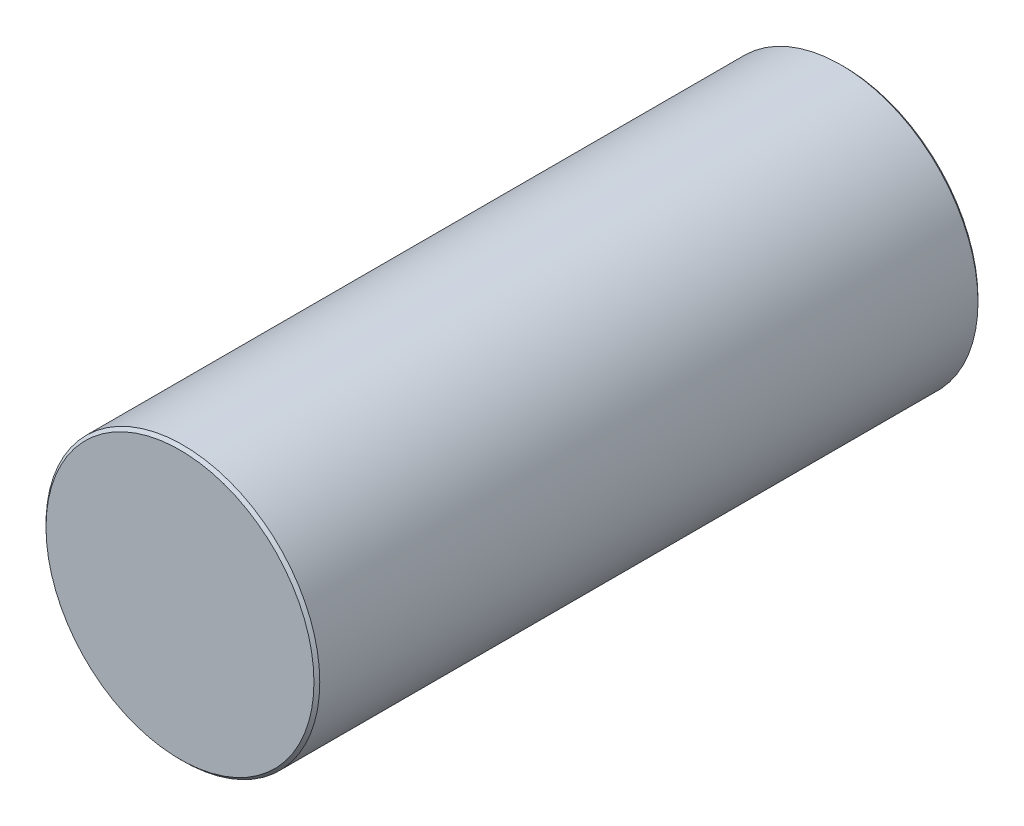
ISO-10303-21;
HEADER;
FILE_DESCRIPTION(('STEP AP214'),'2;1');
FILE_NAME('part.step','',(''),(''),'','','');
FILE_SCHEMA(('AUTOMOTIVE_DESIGN { 1 0 10303 214 1 1 1 1 }'));
ENDSEC;
DATA;
#1=APPLICATION_CONTEXT('core data for automotive mechanical design processes');
#2=APPLICATION_PROTOCOL_DEFINITION('international standard','automotive_design',2000,#1);
#3=PRODUCT_CONTEXT('',#1,'mechanical');
#4=PRODUCT('Part','Part','',(#3));
#5=PRODUCT_RELATED_PRODUCT_CATEGORY('part','',(#4));
#6=PRODUCT_DEFINITION_FORMATION('','',#4);
#7=PRODUCT_DEFINITION_CONTEXT('part definition',#1,'design');
#8=PRODUCT_DEFINITION('design','',#6,#7);
#9=PRODUCT_DEFINITION_SHAPE('','',#8);
#10=(LENGTH_UNIT() NAMED_UNIT(*) SI_UNIT(.MILLI.,.METRE.));
#11=(NAMED_UNIT(*) PLANE_ANGLE_UNIT() SI_UNIT($,.RADIAN.));
#12=(NAMED_UNIT(*) SI_UNIT($,.STERADIAN.) SOLID_ANGLE_UNIT());
#13=UNCERTAINTY_MEASURE_WITH_UNIT(LENGTH_MEASURE(1.E-05),#10,'distance_accuracy_value','');
#14=(GEOMETRIC_REPRESENTATION_CONTEXT(3) GLOBAL_UNCERTAINTY_ASSIGNED_CONTEXT((#13)) GLOBAL_UNIT_ASSIGNED_CONTEXT((#10,
#11,#12)) REPRESENTATION_CONTEXT('',''));
#15=CARTESIAN_POINT('',(0.,0.,0.));
#16=DIRECTION('',(0.,0.,1.));
#17=DIRECTION('',(1.,0.,0.));
#18=AXIS2_PLACEMENT_3D('',#15,#16,#17);
#19=CARTESIAN_POINT('',(0.,0.,11.4));
#20=DIRECTION('',(0.,0.,-1.));
#21=DIRECTION('',(-1.,0.,0.));
#22=AXIS2_PLACEMENT_3D('',#19,#20,#21);
#23=CYLINDRICAL_SURFACE('',#22,2.35);
#24=CARTESIAN_POINT('',(0.,0.,11.35));
#25=DIRECTION('',(0.,0.,1.));
#26=DIRECTION('',(1.,0.,0.));
#27=AXIS2_PLACEMENT_3D('',#24,#25,#26);
#28=CIRCLE('',#27,2.35);
#29=CARTESIAN_POINT('',(2.35,0.,11.35));
#30=VERTEX_POINT('',#29);
#31=EDGE_CURVE('E54',#30,#30,#28,.F.);
#32=ORIENTED_EDGE('',*,*,#31,.T.);
#33=EDGE_LOOP('',(#32));
#34=FACE_BOUND('',#33,.T.);
#35=CARTESIAN_POINT('',(0.,0.,0.0500000000000032));
#36=DIRECTION('',(0.,0.,1.));
#37=DIRECTION('',(1.,0.,0.));
#38=AXIS2_PLACEMENT_3D('',#35,#36,#37);
#39=CIRCLE('',#38,2.35);
#40=CARTESIAN_POINT('',(2.35,0.,0.0500000000000032));
#41=VERTEX_POINT('',#40);
#42=EDGE_CURVE('E59',#41,#41,#39,.T.);
#43=ORIENTED_EDGE('',*,*,#42,.T.);
#44=EDGE_LOOP('',(#43));
#45=FACE_BOUND('',#44,.T.);
#46=ADVANCED_FACE('F45',(#34,#45),#23,.T.);
#47=CARTESIAN_POINT('',(0.,0.,11.4));
#48=DIRECTION('',(0.,0.,1.));
#49=DIRECTION('',(1.,0.,0.));
#50=AXIS2_PLACEMENT_3D('',#47,#48,#49);
#51=PLANE('',#50);
#52=CARTESIAN_POINT('',(0.,0.,11.4));
#53=DIRECTION('',(0.,0.,1.));
#54=DIRECTION('',(1.,0.,0.));
#55=AXIS2_PLACEMENT_3D('',#52,#53,#54);
#56=CIRCLE('',#55,2.3);
#57=CARTESIAN_POINT('',(2.3,0.,11.4));
#58=VERTEX_POINT('',#57);
#59=EDGE_CURVE('E64',#58,#58,#56,.T.);
#60=ORIENTED_EDGE('',*,*,#59,.T.);
#61=EDGE_LOOP('',(#60));
#62=FACE_BOUND('',#61,.T.);
#63=ADVANCED_FACE('F71',(#62),#51,.T.);
#64=CARTESIAN_POINT('',(0.,0.,0.));
#65=DIRECTION('',(0.,0.,1.));
#66=DIRECTION('',(1.,0.,0.));
#67=AXIS2_PLACEMENT_3D('',#64,#65,#66);
#68=PLANE('',#67);
#69=CARTESIAN_POINT('',(0.,0.,0.));
#70=DIRECTION('',(0.,0.,1.));
#71=DIRECTION('',(1.,0.,0.));
#72=AXIS2_PLACEMENT_3D('',#69,#70,#71);
#73=CIRCLE('',#72,2.3);
#74=CARTESIAN_POINT('',(2.3,0.,0.));
#75=VERTEX_POINT('',#74);
#76=EDGE_CURVE('E10',#75,#75,#73,.F.);
#77=ORIENTED_EDGE('',*,*,#76,.T.);
#78=EDGE_LOOP('',(#77));
#79=FACE_BOUND('',#78,.T.);
#80=ADVANCED_FACE('F75',(#79),#68,.F.);
#81=CARTESIAN_POINT('',(0.,0.,11.4));
#82=DIRECTION('',(0.,0.,-1.));
#83=DIRECTION('',(-1.,0.,0.));
#84=AXIS2_PLACEMENT_3D('',#81,#82,#83);
#85=CONICAL_SURFACE('',#84,2.3,0.78539816339747);
#86=ORIENTED_EDGE('',*,*,#31,.F.);
#87=EDGE_LOOP('',(#86));
#88=FACE_BOUND('',#87,.T.);
#89=ORIENTED_EDGE('',*,*,#59,.F.);
#90=EDGE_LOOP('',(#89));
#91=FACE_BOUND('',#90,.T.);
#92=ADVANCED_FACE('F73',(#88,#91),#85,.T.);
#93=CARTESIAN_POINT('',(0.,0.,0.0500000000000032));
#94=DIRECTION('',(0.,0.,1.));
#95=DIRECTION('',(1.,0.,0.));
#96=AXIS2_PLACEMENT_3D('',#93,#94,#95);
#97=CONICAL_SURFACE('',#96,2.35,0.785398163397444);
#98=ORIENTED_EDGE('',*,*,#76,.F.);
#99=EDGE_LOOP('',(#98));
#100=FACE_BOUND('',#99,.T.);
#101=ORIENTED_EDGE('',*,*,#42,.F.);
#102=EDGE_LOOP('',(#101));
#103=FACE_BOUND('',#102,.T.);
#104=ADVANCED_FACE('F48',(#100,#103),#97,.T.);
#105=CLOSED_SHELL('',(#46,#63,#80,#92,#104));
#106=MANIFOLD_SOLID_BREP('B2',#105);
#107=ADVANCED_BREP_SHAPE_REPRESENTATION('',(#18,#106),#14);
#108=SHAPE_DEFINITION_REPRESENTATION(#9,#107);
ENDSEC;
END-ISO-10303-21;
